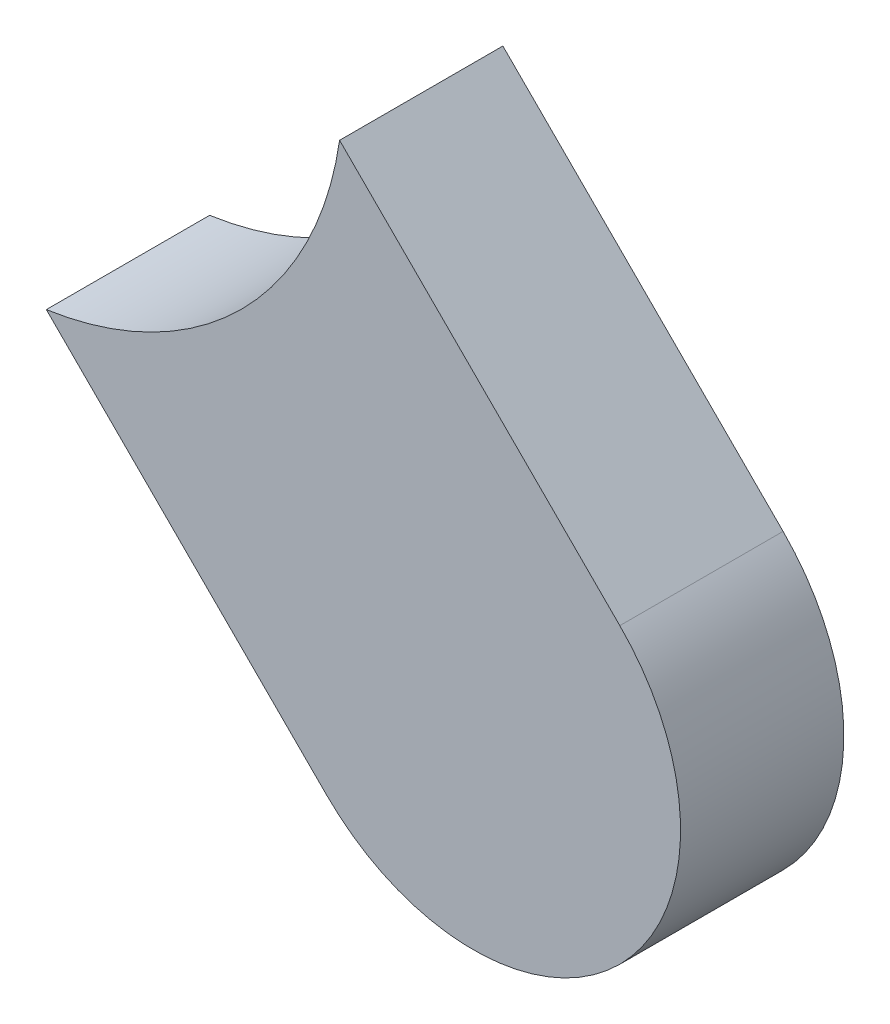
ISO-10303-21;
HEADER;
FILE_DESCRIPTION(('STEP AP214'),'2;1');
FILE_NAME('part.step','',(''),(''),'','','');
FILE_SCHEMA(('AUTOMOTIVE_DESIGN { 1 0 10303 214 1 1 1 1 }'));
ENDSEC;
DATA;
#1=APPLICATION_CONTEXT('core data for automotive mechanical design processes');
#2=APPLICATION_PROTOCOL_DEFINITION('international standard','automotive_design',2000,#1);
#3=PRODUCT_CONTEXT('',#1,'mechanical');
#4=PRODUCT('Part','Part','',(#3));
#5=PRODUCT_RELATED_PRODUCT_CATEGORY('part','',(#4));
#6=PRODUCT_DEFINITION_FORMATION('','',#4);
#7=PRODUCT_DEFINITION_CONTEXT('part definition',#1,'design');
#8=PRODUCT_DEFINITION('design','',#6,#7);
#9=PRODUCT_DEFINITION_SHAPE('','',#8);
#10=(LENGTH_UNIT() NAMED_UNIT(*) SI_UNIT(.MILLI.,.METRE.));
#11=(NAMED_UNIT(*) PLANE_ANGLE_UNIT() SI_UNIT($,.RADIAN.));
#12=(NAMED_UNIT(*) SI_UNIT($,.STERADIAN.) SOLID_ANGLE_UNIT());
#13=UNCERTAINTY_MEASURE_WITH_UNIT(LENGTH_MEASURE(1.E-05),#10,'distance_accuracy_value','');
#14=(GEOMETRIC_REPRESENTATION_CONTEXT(3) GLOBAL_UNCERTAINTY_ASSIGNED_CONTEXT((#13)) GLOBAL_UNIT_ASSIGNED_CONTEXT((#10,
#11,#12)) REPRESENTATION_CONTEXT('',''));
#15=CARTESIAN_POINT('',(0.,0.,0.));
#16=DIRECTION('',(0.,0.,1.));
#17=DIRECTION('',(1.,0.,0.));
#18=AXIS2_PLACEMENT_3D('',#15,#16,#17);
#19=CARTESIAN_POINT('',(137.983341052133,108.164449607867,0.));
#20=DIRECTION('',(0.707106781186556,0.707106781186539,0.));
#21=DIRECTION('',(0.707106781186539,-0.707106781186556,0.));
#22=AXIS2_PLACEMENT_3D('',#19,#20,#21);
#23=PLANE('',#22);
#24=DIRECTION('',(0.707106781186539,-0.707106781186556,0.));
#25=VECTOR('',#24,1.);
#26=CARTESIAN_POINT('',(137.74239406,108.4053966,0.1999996));
#27=LINE('',#26,#25);
#28=CARTESIAN_POINT('',(137.983341052133,108.164449607867,0.1999996));
#29=VERTEX_POINT('',#28);
#30=CARTESIAN_POINT('',(138.3265966,107.82119406,0.1999996));
#31=VERTEX_POINT('',#30);
#32=EDGE_CURVE('E11',#29,#31,#27,.T.);
#33=ORIENTED_EDGE('',*,*,#32,.F.);
#34=DIRECTION('',(0.,0.,1.));
#35=VECTOR('',#34,1.);
#36=CARTESIAN_POINT('',(137.983341052133,108.164449607867,0.));
#37=LINE('',#36,#35);
#38=CARTESIAN_POINT('',(137.983341052133,108.164449607867,0.));
#39=VERTEX_POINT('',#38);
#40=EDGE_CURVE('E24',#39,#29,#37,.T.);
#41=ORIENTED_EDGE('',*,*,#40,.F.);
#42=DIRECTION('',(0.707106781186539,-0.707106781186556,0.));
#43=VECTOR('',#42,1.);
#44=CARTESIAN_POINT('',(137.74239406,108.4053966,0.));
#45=LINE('',#44,#43);
#46=CARTESIAN_POINT('',(138.3265966,107.82119406,0.));
#47=VERTEX_POINT('',#46);
#48=EDGE_CURVE('E75',#39,#47,#45,.T.);
#49=ORIENTED_EDGE('',*,*,#48,.T.);
#50=DIRECTION('',(0.,0.,1.));
#51=VECTOR('',#50,1.);
#52=CARTESIAN_POINT('',(138.3265966,107.82119406,0.));
#53=LINE('',#52,#51);
#54=EDGE_CURVE('E37',#47,#31,#53,.T.);
#55=ORIENTED_EDGE('',*,*,#54,.T.);
#56=EDGE_LOOP('',(#33,#41,#49,#55));
#57=FACE_BOUND('',#56,.T.);
#58=ADVANCED_FACE('F17',(#57),#23,.F.);
#59=CARTESIAN_POINT('',(138.50620127,108.00079873,0.));
#60=DIRECTION('',(0.,0.,-1.));
#61=DIRECTION('',(-0.707106781186548,-0.707106781186548,0.));
#62=AXIS2_PLACEMENT_3D('',#59,#60,#61);
#63=CYLINDRICAL_SURFACE('',#62,0.253999360179552);
#64=CARTESIAN_POINT('',(138.50620127,108.00079873,0.1999996));
#65=DIRECTION('',(0.,0.,1.));
#66=DIRECTION('',(-0.707106781186548,-0.707106781186548,0.));
#67=AXIS2_PLACEMENT_3D('',#64,#65,#66);
#68=CIRCLE('',#67,0.253999360179552);
#69=CARTESIAN_POINT('',(138.68580594,108.1804034,0.1999996));
#70=VERTEX_POINT('',#69);
#71=EDGE_CURVE('E83',#31,#70,#68,.T.);
#72=ORIENTED_EDGE('',*,*,#71,.F.);
#73=ORIENTED_EDGE('',*,*,#54,.F.);
#74=CARTESIAN_POINT('',(138.50620127,108.00079873,0.));
#75=DIRECTION('',(0.,0.,1.));
#76=DIRECTION('',(-0.707106781186548,-0.707106781186548,0.));
#77=AXIS2_PLACEMENT_3D('',#74,#75,#76);
#78=CIRCLE('',#77,0.253999360179552);
#79=CARTESIAN_POINT('',(138.68580594,108.1804034,0.));
#80=VERTEX_POINT('',#79);
#81=EDGE_CURVE('E81',#47,#80,#78,.T.);
#82=ORIENTED_EDGE('',*,*,#81,.T.);
#83=DIRECTION('',(0.,0.,1.));
#84=VECTOR('',#83,1.);
#85=CARTESIAN_POINT('',(138.68580594,108.1804034,0.));
#86=LINE('',#85,#84);
#87=EDGE_CURVE('E67',#80,#70,#86,.T.);
#88=ORIENTED_EDGE('',*,*,#87,.T.);
#89=EDGE_LOOP('',(#72,#73,#82,#88));
#90=FACE_BOUND('',#89,.T.);
#91=ADVANCED_FACE('F89',(#90),#63,.T.);
#92=CARTESIAN_POINT('',(138.68580594,108.1804034,0.));
#93=DIRECTION('',(-0.707106781186539,-0.707106781186556,0.));
#94=DIRECTION('',(-0.707106781186556,0.707106781186539,0.));
#95=AXIS2_PLACEMENT_3D('',#92,#93,#94);
#96=PLANE('',#95);
#97=DIRECTION('',(-0.707106781186556,0.707106781186539,0.));
#98=VECTOR('',#97,1.);
#99=CARTESIAN_POINT('',(138.68580594,108.1804034,0.1999996));
#100=LINE('',#99,#98);
#101=CARTESIAN_POINT('',(138.342550392133,108.523658947867,0.1999996));
#102=VERTEX_POINT('',#101);
#103=EDGE_CURVE('E71',#70,#102,#100,.T.);
#104=ORIENTED_EDGE('',*,*,#103,.F.);
#105=ORIENTED_EDGE('',*,*,#87,.F.);
#106=DIRECTION('',(-0.707106781186556,0.707106781186539,0.));
#107=VECTOR('',#106,1.);
#108=CARTESIAN_POINT('',(138.68580594,108.1804034,0.));
#109=LINE('',#108,#107);
#110=CARTESIAN_POINT('',(138.342550392133,108.523658947867,0.));
#111=VERTEX_POINT('',#110);
#112=EDGE_CURVE('E63',#80,#111,#109,.T.);
#113=ORIENTED_EDGE('',*,*,#112,.T.);
#114=DIRECTION('',(0.,0.,1.));
#115=VECTOR('',#114,1.);
#116=CARTESIAN_POINT('',(138.342550392133,108.523658947867,0.));
#117=LINE('',#116,#115);
#118=EDGE_CURVE('E53',#111,#102,#117,.T.);
#119=ORIENTED_EDGE('',*,*,#118,.T.);
#120=EDGE_LOOP('',(#104,#105,#113,#119));
#121=FACE_BOUND('',#120,.T.);
#122=ADVANCED_FACE('F66',(#121),#96,.F.);
#123=CARTESIAN_POINT('',(137.922,108.585,0.));
#124=DIRECTION('',(0.,0.,-1.));
#125=DIRECTION('',(1.,0.,0.));
#126=AXIS2_PLACEMENT_3D('',#123,#124,#125);
#127=CYLINDRICAL_SURFACE('',#126,0.42500042);
#128=ORIENTED_EDGE('',*,*,#40,.T.);
#129=CARTESIAN_POINT('',(137.922,108.585,0.1999996));
#130=DIRECTION('',(0.,0.,1.));
#131=DIRECTION('',(1.,0.,0.));
#132=AXIS2_PLACEMENT_3D('',#129,#130,#131);
#133=CIRCLE('',#132,0.42500042);
#134=EDGE_CURVE('E59',#29,#102,#133,.T.);
#135=ORIENTED_EDGE('',*,*,#134,.T.);
#136=ORIENTED_EDGE('',*,*,#118,.F.);
#137=CARTESIAN_POINT('',(137.922,108.585,0.));
#138=DIRECTION('',(0.,0.,1.));
#139=DIRECTION('',(1.,0.,0.));
#140=AXIS2_PLACEMENT_3D('',#137,#138,#139);
#141=CIRCLE('',#140,0.42500042);
#142=EDGE_CURVE('E57',#39,#111,#141,.T.);
#143=ORIENTED_EDGE('',*,*,#142,.F.);
#144=EDGE_LOOP('',(#128,#135,#136,#143));
#145=FACE_BOUND('',#144,.T.);
#146=ADVANCED_FACE('F55',(#145),#127,.F.);
#147=CARTESIAN_POINT('',(137.74239406,108.4053966,0.));
#148=DIRECTION('',(0.,0.,-1.));
#149=DIRECTION('',(-1.,0.,0.));
#150=AXIS2_PLACEMENT_3D('',#147,#148,#149);
#151=PLANE('',#150);
#152=ORIENTED_EDGE('',*,*,#48,.F.);
#153=ORIENTED_EDGE('',*,*,#142,.T.);
#154=ORIENTED_EDGE('',*,*,#112,.F.);
#155=ORIENTED_EDGE('',*,*,#81,.F.);
#156=EDGE_LOOP('',(#152,#153,#154,#155));
#157=FACE_BOUND('',#156,.T.);
#158=ADVANCED_FACE('F74',(#157),#151,.T.);
#159=CARTESIAN_POINT('',(137.74239406,108.4053966,0.1999996));
#160=DIRECTION('',(0.,0.,-1.));
#161=DIRECTION('',(-1.,0.,0.));
#162=AXIS2_PLACEMENT_3D('',#159,#160,#161);
#163=PLANE('',#162);
#164=ORIENTED_EDGE('',*,*,#134,.F.);
#165=ORIENTED_EDGE('',*,*,#32,.T.);
#166=ORIENTED_EDGE('',*,*,#71,.T.);
#167=ORIENTED_EDGE('',*,*,#103,.T.);
#168=EDGE_LOOP('',(#164,#165,#166,#167));
#169=FACE_BOUND('',#168,.T.);
#170=ADVANCED_FACE('F91',(#169),#163,.F.);
#171=CLOSED_SHELL('',(#58,#91,#122,#146,#158,#170));
#172=MANIFOLD_SOLID_BREP('B1',#171);
#173=ADVANCED_BREP_SHAPE_REPRESENTATION('',(#18,#172),#14);
#174=SHAPE_DEFINITION_REPRESENTATION(#9,#173);
ENDSEC;
END-ISO-10303-21;
